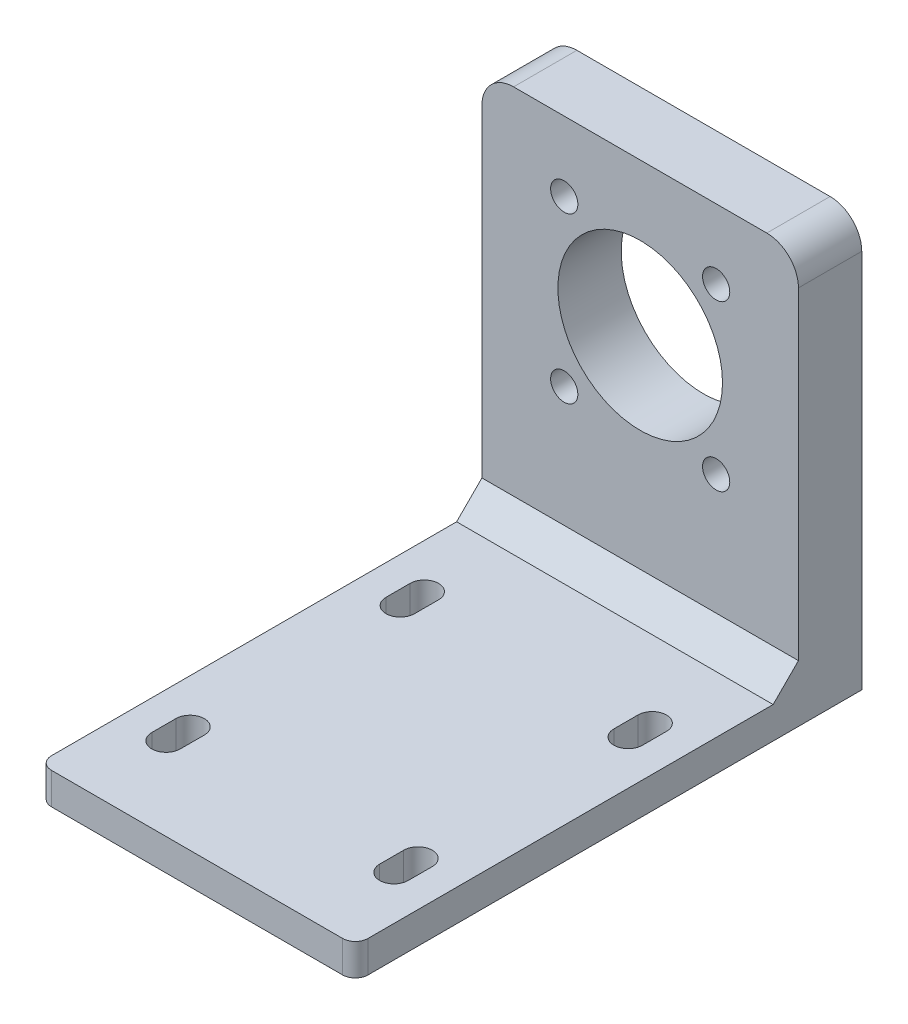
ISO-10303-21;
HEADER;
FILE_DESCRIPTION(('STEP AP214'),'2;1');
FILE_NAME('part.step','',(''),(''),'','','');
FILE_SCHEMA(('AUTOMOTIVE_DESIGN { 1 0 10303 214 1 1 1 1 }'));
ENDSEC;
DATA;
#1=APPLICATION_CONTEXT('core data for automotive mechanical design processes');
#2=APPLICATION_PROTOCOL_DEFINITION('international standard','automotive_design',2000,#1);
#3=PRODUCT_CONTEXT('',#1,'mechanical');
#4=PRODUCT('Part','Part','',(#3));
#5=PRODUCT_RELATED_PRODUCT_CATEGORY('part','',(#4));
#6=PRODUCT_DEFINITION_FORMATION('','',#4);
#7=PRODUCT_DEFINITION_CONTEXT('part definition',#1,'design');
#8=PRODUCT_DEFINITION('design','',#6,#7);
#9=PRODUCT_DEFINITION_SHAPE('','',#8);
#10=(LENGTH_UNIT() NAMED_UNIT(*) SI_UNIT(.MILLI.,.METRE.));
#11=(NAMED_UNIT(*) PLANE_ANGLE_UNIT() SI_UNIT($,.RADIAN.));
#12=(NAMED_UNIT(*) SI_UNIT($,.STERADIAN.) SOLID_ANGLE_UNIT());
#13=UNCERTAINTY_MEASURE_WITH_UNIT(LENGTH_MEASURE(1.E-05),#10,'distance_accuracy_value','');
#14=(GEOMETRIC_REPRESENTATION_CONTEXT(3) GLOBAL_UNCERTAINTY_ASSIGNED_CONTEXT((#13)) GLOBAL_UNIT_ASSIGNED_CONTEXT((#10,
#11,#12)) REPRESENTATION_CONTEXT('',''));
#15=CARTESIAN_POINT('',(0.,0.,0.));
#16=DIRECTION('',(0.,0.,1.));
#17=DIRECTION('',(1.,0.,0.));
#18=AXIS2_PLACEMENT_3D('',#15,#16,#17);
#19=CARTESIAN_POINT('',(25.,-30.,80.));
#20=DIRECTION('',(0.,-1.,0.));
#21=DIRECTION('',(0.,0.,-1.));
#22=AXIS2_PLACEMENT_3D('',#19,#20,#21);
#23=PLANE('',#22);
#24=DIRECTION('',(0.,0.,-1.));
#25=VECTOR('',#24,1.);
#26=CARTESIAN_POINT('',(-15.75,-30.,80.));
#27=LINE('',#26,#25);
#28=CARTESIAN_POINT('',(-15.75,-30.,66.9));
#29=VERTEX_POINT('',#28);
#30=CARTESIAN_POINT('',(-15.75,-30.,63.1));
#31=VERTEX_POINT('',#30);
#32=EDGE_CURVE('E334',#29,#31,#27,.T.);
#33=ORIENTED_EDGE('',*,*,#32,.F.);
#34=CARTESIAN_POINT('',(-18.,-30.,66.9));
#35=DIRECTION('',(0.,-1.,0.));
#36=DIRECTION('',(0.,0.,-1.));
#37=AXIS2_PLACEMENT_3D('',#34,#35,#36);
#38=CIRCLE('',#37,2.25);
#39=CARTESIAN_POINT('',(-20.25,-30.,66.9));
#40=VERTEX_POINT('',#39);
#41=EDGE_CURVE('E327',#40,#29,#38,.F.);
#42=ORIENTED_EDGE('',*,*,#41,.F.);
#43=DIRECTION('',(0.,0.,-1.));
#44=VECTOR('',#43,1.);
#45=CARTESIAN_POINT('',(-20.25,-30.,80.));
#46=LINE('',#45,#44);
#47=CARTESIAN_POINT('',(-20.25,-30.,63.1));
#48=VERTEX_POINT('',#47);
#49=EDGE_CURVE('E329',#40,#48,#46,.T.);
#50=ORIENTED_EDGE('',*,*,#49,.T.);
#51=CARTESIAN_POINT('',(-18.,-30.,63.1));
#52=DIRECTION('',(0.,-1.,0.));
#53=DIRECTION('',(0.,0.,-1.));
#54=AXIS2_PLACEMENT_3D('',#51,#52,#53);
#55=CIRCLE('',#54,2.25);
#56=EDGE_CURVE('E332',#31,#48,#55,.F.);
#57=ORIENTED_EDGE('',*,*,#56,.F.);
#58=EDGE_LOOP('',(#33,#42,#50,#57));
#59=FACE_BOUND('',#58,.T.);
#60=DIRECTION('',(0.,0.,1.));
#61=VECTOR('',#60,1.);
#62=CARTESIAN_POINT('',(-20.25,-30.,80.));
#63=LINE('',#62,#61);
#64=CARTESIAN_POINT('',(-20.25,-30.,26.1));
#65=VERTEX_POINT('',#64);
#66=CARTESIAN_POINT('',(-20.25,-30.,29.9));
#67=VERTEX_POINT('',#66);
#68=EDGE_CURVE('E303',#65,#67,#63,.T.);
#69=ORIENTED_EDGE('',*,*,#68,.F.);
#70=CARTESIAN_POINT('',(-18.,-30.,26.1));
#71=DIRECTION('',(0.,-1.,0.));
#72=DIRECTION('',(0.,0.,-1.));
#73=AXIS2_PLACEMENT_3D('',#70,#71,#72);
#74=CIRCLE('',#73,2.25);
#75=CARTESIAN_POINT('',(-15.75,-30.,26.1));
#76=VERTEX_POINT('',#75);
#77=EDGE_CURVE('E275',#76,#65,#74,.F.);
#78=ORIENTED_EDGE('',*,*,#77,.F.);
#79=DIRECTION('',(0.,0.,1.));
#80=VECTOR('',#79,1.);
#81=CARTESIAN_POINT('',(-15.75,-30.,80.));
#82=LINE('',#81,#80);
#83=CARTESIAN_POINT('',(-15.75,-30.,29.9));
#84=VERTEX_POINT('',#83);
#85=EDGE_CURVE('E298',#76,#84,#82,.T.);
#86=ORIENTED_EDGE('',*,*,#85,.T.);
#87=CARTESIAN_POINT('',(-18.,-30.,29.9));
#88=DIRECTION('',(0.,-1.,0.));
#89=DIRECTION('',(0.,0.,-1.));
#90=AXIS2_PLACEMENT_3D('',#87,#88,#89);
#91=CIRCLE('',#90,2.25);
#92=EDGE_CURVE('E301',#67,#84,#91,.F.);
#93=ORIENTED_EDGE('',*,*,#92,.F.);
#94=EDGE_LOOP('',(#69,#78,#86,#93));
#95=FACE_BOUND('',#94,.T.);
#96=DIRECTION('',(0.,0.,1.));
#97=VECTOR('',#96,1.);
#98=CARTESIAN_POINT('',(20.25,-30.,80.));
#99=LINE('',#98,#97);
#100=CARTESIAN_POINT('',(20.25,-30.,26.1));
#101=VERTEX_POINT('',#100);
#102=CARTESIAN_POINT('',(20.25,-30.,29.9));
#103=VERTEX_POINT('',#102);
#104=EDGE_CURVE('E310',#101,#103,#99,.T.);
#105=ORIENTED_EDGE('',*,*,#104,.T.);
#106=CARTESIAN_POINT('',(18.,-30.,29.9));
#107=DIRECTION('',(0.,-1.,0.));
#108=DIRECTION('',(0.,0.,-1.));
#109=AXIS2_PLACEMENT_3D('',#106,#107,#108);
#110=CIRCLE('',#109,2.25);
#111=CARTESIAN_POINT('',(15.75,-30.,29.9));
#112=VERTEX_POINT('',#111);
#113=EDGE_CURVE('E313',#103,#112,#110,.T.);
#114=ORIENTED_EDGE('',*,*,#113,.T.);
#115=DIRECTION('',(0.,0.,1.));
#116=VECTOR('',#115,1.);
#117=CARTESIAN_POINT('',(15.7500000000001,-30.,80.));
#118=LINE('',#117,#116);
#119=CARTESIAN_POINT('',(15.75,-30.,26.1));
#120=VERTEX_POINT('',#119);
#121=EDGE_CURVE('E305',#120,#112,#118,.T.);
#122=ORIENTED_EDGE('',*,*,#121,.F.);
#123=CARTESIAN_POINT('',(18.,-30.,26.1));
#124=DIRECTION('',(0.,-1.,0.));
#125=DIRECTION('',(0.,0.,-1.));
#126=AXIS2_PLACEMENT_3D('',#123,#124,#125);
#127=CIRCLE('',#126,2.25);
#128=EDGE_CURVE('E307',#120,#101,#127,.T.);
#129=ORIENTED_EDGE('',*,*,#128,.T.);
#130=EDGE_LOOP('',(#105,#114,#122,#129));
#131=FACE_BOUND('',#130,.T.);
#132=DIRECTION('',(0.,0.,-1.));
#133=VECTOR('',#132,1.);
#134=CARTESIAN_POINT('',(20.25,-30.,80.));
#135=LINE('',#134,#133);
#136=CARTESIAN_POINT('',(20.25,-30.,66.9));
#137=VERTEX_POINT('',#136);
#138=CARTESIAN_POINT('',(20.25,-30.,63.1));
#139=VERTEX_POINT('',#138);
#140=EDGE_CURVE('E322',#137,#139,#135,.T.);
#141=ORIENTED_EDGE('',*,*,#140,.F.);
#142=CARTESIAN_POINT('',(18.,-30.,66.9));
#143=DIRECTION('',(0.,-1.,0.));
#144=DIRECTION('',(0.,0.,-1.));
#145=AXIS2_PLACEMENT_3D('',#142,#143,#144);
#146=CIRCLE('',#145,2.25);
#147=CARTESIAN_POINT('',(15.75,-30.,66.9));
#148=VERTEX_POINT('',#147);
#149=EDGE_CURVE('E324',#137,#148,#146,.T.);
#150=ORIENTED_EDGE('',*,*,#149,.T.);
#151=DIRECTION('',(0.,0.,-1.));
#152=VECTOR('',#151,1.);
#153=CARTESIAN_POINT('',(15.75,-30.,80.));
#154=LINE('',#153,#152);
#155=CARTESIAN_POINT('',(15.75,-30.,63.1));
#156=VERTEX_POINT('',#155);
#157=EDGE_CURVE('E316',#148,#156,#154,.T.);
#158=ORIENTED_EDGE('',*,*,#157,.T.);
#159=CARTESIAN_POINT('',(18.,-30.,63.1));
#160=DIRECTION('',(0.,-1.,0.));
#161=DIRECTION('',(0.,0.,-1.));
#162=AXIS2_PLACEMENT_3D('',#159,#160,#161);
#163=CIRCLE('',#162,2.25);
#164=EDGE_CURVE('E319',#156,#139,#163,.T.);
#165=ORIENTED_EDGE('',*,*,#164,.T.);
#166=EDGE_LOOP('',(#141,#150,#158,#165));
#167=FACE_BOUND('',#166,.T.);
#168=DIRECTION('',(1.,0.,0.));
#169=VECTOR('',#168,1.);
#170=CARTESIAN_POINT('',(25.,-30.,14.));
#171=LINE('',#170,#169);
#172=CARTESIAN_POINT('',(-25.,-30.,14.));
#173=VERTEX_POINT('',#172);
#174=CARTESIAN_POINT('',(25.,-30.,14.));
#175=VERTEX_POINT('',#174);
#176=EDGE_CURVE('E217',#173,#175,#171,.T.);
#177=ORIENTED_EDGE('',*,*,#176,.F.);
#178=DIRECTION('',(0.,0.,-1.));
#179=VECTOR('',#178,1.);
#180=CARTESIAN_POINT('',(-25.,-30.,80.));
#181=LINE('',#180,#179);
#182=CARTESIAN_POINT('',(-25.,-30.,78.));
#183=VERTEX_POINT('',#182);
#184=EDGE_CURVE('E227',#183,#173,#181,.T.);
#185=ORIENTED_EDGE('',*,*,#184,.F.);
#186=CARTESIAN_POINT('',(-23.,-30.,78.));
#187=DIRECTION('',(0.,-1.,0.));
#188=DIRECTION('',(0.,0.,-1.));
#189=AXIS2_PLACEMENT_3D('',#186,#187,#188);
#190=CIRCLE('',#189,2.);
#191=CARTESIAN_POINT('',(-23.,-30.,80.));
#192=VERTEX_POINT('',#191);
#193=EDGE_CURVE('E360',#183,#192,#190,.F.);
#194=ORIENTED_EDGE('',*,*,#193,.T.);
#195=DIRECTION('',(-1.,0.,0.));
#196=VECTOR('',#195,1.);
#197=CARTESIAN_POINT('',(25.,-30.,80.));
#198=LINE('',#197,#196);
#199=CARTESIAN_POINT('',(23.,-30.,80.));
#200=VERTEX_POINT('',#199);
#201=EDGE_CURVE('E234',#200,#192,#198,.T.);
#202=ORIENTED_EDGE('',*,*,#201,.F.);
#203=CARTESIAN_POINT('',(23.,-30.,78.));
#204=DIRECTION('',(0.,-1.,0.));
#205=DIRECTION('',(0.,0.,-1.));
#206=AXIS2_PLACEMENT_3D('',#203,#204,#205);
#207=CIRCLE('',#206,2.);
#208=CARTESIAN_POINT('',(25.,-30.,78.));
#209=VERTEX_POINT('',#208);
#210=EDGE_CURVE('E362',#200,#209,#207,.F.);
#211=ORIENTED_EDGE('',*,*,#210,.T.);
#212=DIRECTION('',(0.,0.,-1.));
#213=VECTOR('',#212,1.);
#214=CARTESIAN_POINT('',(25.,-30.,80.));
#215=LINE('',#214,#213);
#216=EDGE_CURVE('E230',#209,#175,#215,.T.);
#217=ORIENTED_EDGE('',*,*,#216,.T.);
#218=EDGE_LOOP('',(#177,#185,#194,#202,#211,#217));
#219=FACE_BOUND('',#218,.T.);
#220=ADVANCED_FACE('F38',(#59,#95,#131,#167,#219),#23,.F.);
#221=CARTESIAN_POINT('',(0.,0.,10.));
#222=DIRECTION('',(0.,0.,1.));
#223=DIRECTION('',(1.,0.,0.));
#224=AXIS2_PLACEMENT_3D('',#221,#222,#223);
#225=PLANE('',#224);
#226=CARTESIAN_POINT('',(0.,6.,10.));
#227=DIRECTION('',(0.,0.,1.));
#228=DIRECTION('',(1.,0.,0.));
#229=AXIS2_PLACEMENT_3D('',#226,#227,#228);
#230=CIRCLE('',#229,13.);
#231=CARTESIAN_POINT('',(13.,6.,10.));
#232=VERTEX_POINT('',#231);
#233=EDGE_CURVE('E260',#232,#232,#230,.T.);
#234=ORIENTED_EDGE('',*,*,#233,.F.);
#235=EDGE_LOOP('',(#234));
#236=FACE_BOUND('',#235,.T.);
#237=CARTESIAN_POINT('',(12.,19.,10.));
#238=DIRECTION('',(0.,0.,1.));
#239=DIRECTION('',(1.,0.,0.));
#240=AXIS2_PLACEMENT_3D('',#237,#238,#239);
#241=CIRCLE('',#240,2.15);
#242=CARTESIAN_POINT('',(14.15,19.,10.));
#243=VERTEX_POINT('',#242);
#244=EDGE_CURVE('E263',#243,#243,#241,.F.);
#245=ORIENTED_EDGE('',*,*,#244,.T.);
#246=EDGE_LOOP('',(#245));
#247=FACE_BOUND('',#246,.T.);
#248=CARTESIAN_POINT('',(-12.,19.,10.));
#249=DIRECTION('',(0.,0.,1.));
#250=DIRECTION('',(1.,0.,0.));
#251=AXIS2_PLACEMENT_3D('',#248,#249,#250);
#252=CIRCLE('',#251,2.15);
#253=CARTESIAN_POINT('',(-9.84999999999999,19.,10.));
#254=VERTEX_POINT('',#253);
#255=EDGE_CURVE('E266',#254,#254,#252,.T.);
#256=ORIENTED_EDGE('',*,*,#255,.F.);
#257=EDGE_LOOP('',(#256));
#258=FACE_BOUND('',#257,.T.);
#259=CARTESIAN_POINT('',(12.,-7.,10.));
#260=DIRECTION('',(0.,0.,1.));
#261=DIRECTION('',(1.,0.,0.));
#262=AXIS2_PLACEMENT_3D('',#259,#260,#261);
#263=CIRCLE('',#262,2.15);
#264=CARTESIAN_POINT('',(14.15,-7.,10.));
#265=VERTEX_POINT('',#264);
#266=EDGE_CURVE('E269',#265,#265,#263,.T.);
#267=ORIENTED_EDGE('',*,*,#266,.F.);
#268=EDGE_LOOP('',(#267));
#269=FACE_BOUND('',#268,.T.);
#270=CARTESIAN_POINT('',(-12.,-7.,10.));
#271=DIRECTION('',(0.,0.,1.));
#272=DIRECTION('',(1.,0.,0.));
#273=AXIS2_PLACEMENT_3D('',#270,#271,#272);
#274=CIRCLE('',#273,2.15);
#275=CARTESIAN_POINT('',(-9.85000000000001,-7.,10.));
#276=VERTEX_POINT('',#275);
#277=EDGE_CURVE('E272',#276,#276,#274,.F.);
#278=ORIENTED_EDGE('',*,*,#277,.T.);
#279=EDGE_LOOP('',(#278));
#280=FACE_BOUND('',#279,.T.);
#281=DIRECTION('',(0.,-1.,0.));
#282=VECTOR('',#281,1.);
#283=CARTESIAN_POINT('',(-25.,0.,10.));
#284=LINE('',#283,#282);
#285=CARTESIAN_POINT('',(-25.,25.,10.));
#286=VERTEX_POINT('',#285);
#287=CARTESIAN_POINT('',(-25.,-26.,10.));
#288=VERTEX_POINT('',#287);
#289=EDGE_CURVE('E251',#286,#288,#284,.T.);
#290=ORIENTED_EDGE('',*,*,#289,.T.);
#291=DIRECTION('',(-1.,0.,0.));
#292=VECTOR('',#291,1.);
#293=CARTESIAN_POINT('',(21.,-26.,10.));
#294=LINE('',#293,#292);
#295=CARTESIAN_POINT('',(25.,-26.,10.));
#296=VERTEX_POINT('',#295);
#297=EDGE_CURVE('E218',#296,#288,#294,.T.);
#298=ORIENTED_EDGE('',*,*,#297,.F.);
#299=DIRECTION('',(0.,-1.,0.));
#300=VECTOR('',#299,1.);
#301=CARTESIAN_POINT('',(25.,0.,10.));
#302=LINE('',#301,#300);
#303=CARTESIAN_POINT('',(25.,25.,10.));
#304=VERTEX_POINT('',#303);
#305=EDGE_CURVE('E253',#304,#296,#302,.T.);
#306=ORIENTED_EDGE('',*,*,#305,.F.);
#307=CARTESIAN_POINT('',(20.,25.,10.));
#308=DIRECTION('',(0.,0.,1.));
#309=DIRECTION('',(1.,0.,0.));
#310=AXIS2_PLACEMENT_3D('',#307,#308,#309);
#311=CIRCLE('',#310,5.);
#312=CARTESIAN_POINT('',(20.,30.,10.));
#313=VERTEX_POINT('',#312);
#314=EDGE_CURVE('E348',#304,#313,#311,.T.);
#315=ORIENTED_EDGE('',*,*,#314,.T.);
#316=DIRECTION('',(1.,0.,0.));
#317=VECTOR('',#316,1.);
#318=CARTESIAN_POINT('',(0.,30.,10.));
#319=LINE('',#318,#317);
#320=CARTESIAN_POINT('',(-20.,30.,10.));
#321=VERTEX_POINT('',#320);
#322=EDGE_CURVE('E257',#321,#313,#319,.T.);
#323=ORIENTED_EDGE('',*,*,#322,.F.);
#324=CARTESIAN_POINT('',(-20.,25.,10.));
#325=DIRECTION('',(0.,0.,1.));
#326=DIRECTION('',(1.,0.,0.));
#327=AXIS2_PLACEMENT_3D('',#324,#325,#326);
#328=CIRCLE('',#327,5.);
#329=EDGE_CURVE('E350',#321,#286,#328,.T.);
#330=ORIENTED_EDGE('',*,*,#329,.T.);
#331=EDGE_LOOP('',(#290,#298,#306,#315,#323,#330));
#332=FACE_BOUND('',#331,.T.);
#333=ADVANCED_FACE('F502',(#236,#247,#258,#269,#280,#332),#225,.T.);
#334=CARTESIAN_POINT('',(0.,-35.,0.));
#335=DIRECTION('',(0.,1.,0.));
#336=DIRECTION('',(0.,0.,1.));
#337=AXIS2_PLACEMENT_3D('',#334,#335,#336);
#338=PLANE('',#337);
#339=DIRECTION('',(0.,0.,1.));
#340=VECTOR('',#339,1.);
#341=CARTESIAN_POINT('',(-15.75,-35.,0.));
#342=LINE('',#341,#340);
#343=CARTESIAN_POINT('',(-15.75,-35.,63.1));
#344=VERTEX_POINT('',#343);
#345=CARTESIAN_POINT('',(-15.75,-35.,66.9));
#346=VERTEX_POINT('',#345);
#347=EDGE_CURVE('E378',#344,#346,#342,.T.);
#348=ORIENTED_EDGE('',*,*,#347,.F.);
#349=CARTESIAN_POINT('',(-18.,-35.,63.1));
#350=DIRECTION('',(0.,1.,0.));
#351=DIRECTION('',(0.,0.,1.));
#352=AXIS2_PLACEMENT_3D('',#349,#350,#351);
#353=CIRCLE('',#352,2.25);
#354=CARTESIAN_POINT('',(-20.25,-35.,63.1));
#355=VERTEX_POINT('',#354);
#356=EDGE_CURVE('E467',#355,#344,#353,.F.);
#357=ORIENTED_EDGE('',*,*,#356,.F.);
#358=DIRECTION('',(0.,0.,1.));
#359=VECTOR('',#358,1.);
#360=CARTESIAN_POINT('',(-20.25,-35.,0.));
#361=LINE('',#360,#359);
#362=CARTESIAN_POINT('',(-20.25,-35.,66.9));
#363=VERTEX_POINT('',#362);
#364=EDGE_CURVE('E464',#355,#363,#361,.T.);
#365=ORIENTED_EDGE('',*,*,#364,.T.);
#366=CARTESIAN_POINT('',(-18.,-35.,66.9));
#367=DIRECTION('',(0.,1.,0.));
#368=DIRECTION('',(0.,0.,1.));
#369=AXIS2_PLACEMENT_3D('',#366,#367,#368);
#370=CIRCLE('',#369,2.25);
#371=EDGE_CURVE('E462',#346,#363,#370,.F.);
#372=ORIENTED_EDGE('',*,*,#371,.F.);
#373=EDGE_LOOP('',(#348,#357,#365,#372));
#374=FACE_BOUND('',#373,.T.);
#375=DIRECTION('',(0.,0.,-1.));
#376=VECTOR('',#375,1.);
#377=CARTESIAN_POINT('',(-20.25,-35.,0.));
#378=LINE('',#377,#376);
#379=CARTESIAN_POINT('',(-20.25,-35.,29.9));
#380=VERTEX_POINT('',#379);
#381=CARTESIAN_POINT('',(-20.25,-35.,26.1));
#382=VERTEX_POINT('',#381);
#383=EDGE_CURVE('E437',#380,#382,#378,.T.);
#384=ORIENTED_EDGE('',*,*,#383,.F.);
#385=CARTESIAN_POINT('',(-18.,-35.,29.9));
#386=DIRECTION('',(0.,1.,0.));
#387=DIRECTION('',(0.,0.,1.));
#388=AXIS2_PLACEMENT_3D('',#385,#386,#387);
#389=CIRCLE('',#388,2.25);
#390=CARTESIAN_POINT('',(-15.75,-35.,29.9));
#391=VERTEX_POINT('',#390);
#392=EDGE_CURVE('E435',#391,#380,#389,.F.);
#393=ORIENTED_EDGE('',*,*,#392,.F.);
#394=DIRECTION('',(0.,0.,-1.));
#395=VECTOR('',#394,1.);
#396=CARTESIAN_POINT('',(-15.75,-35.,0.));
#397=LINE('',#396,#395);
#398=CARTESIAN_POINT('',(-15.75,-35.,26.1));
#399=VERTEX_POINT('',#398);
#400=EDGE_CURVE('E432',#391,#399,#397,.T.);
#401=ORIENTED_EDGE('',*,*,#400,.T.);
#402=CARTESIAN_POINT('',(-18.,-35.,26.1));
#403=DIRECTION('',(0.,1.,0.));
#404=DIRECTION('',(0.,0.,1.));
#405=AXIS2_PLACEMENT_3D('',#402,#403,#404);
#406=CIRCLE('',#405,2.25);
#407=EDGE_CURVE('E430',#382,#399,#406,.F.);
#408=ORIENTED_EDGE('',*,*,#407,.F.);
#409=EDGE_LOOP('',(#384,#393,#401,#408));
#410=FACE_BOUND('',#409,.T.);
#411=DIRECTION('',(0.,0.,1.));
#412=VECTOR('',#411,1.);
#413=CARTESIAN_POINT('',(25.,-35.,10.));
#414=LINE('',#413,#412);
#415=CARTESIAN_POINT('',(25.,-35.,0.));
#416=VERTEX_POINT('',#415);
#417=CARTESIAN_POINT('',(25.,-35.,78.));
#418=VERTEX_POINT('',#417);
#419=EDGE_CURVE('E247',#416,#418,#414,.T.);
#420=ORIENTED_EDGE('',*,*,#419,.T.);
#421=CARTESIAN_POINT('',(23.,-35.,78.));
#422=DIRECTION('',(0.,1.,0.));
#423=DIRECTION('',(0.,0.,1.));
#424=AXIS2_PLACEMENT_3D('',#421,#422,#423);
#425=CIRCLE('',#424,2.);
#426=CARTESIAN_POINT('',(23.,-35.,80.));
#427=VERTEX_POINT('',#426);
#428=EDGE_CURVE('E46',#418,#427,#425,.F.);
#429=ORIENTED_EDGE('',*,*,#428,.T.);
#430=DIRECTION('',(1.,0.,0.));
#431=VECTOR('',#430,1.);
#432=CARTESIAN_POINT('',(-25.,-35.,80.));
#433=LINE('',#432,#431);
#434=CARTESIAN_POINT('',(-23.,-35.,80.));
#435=VERTEX_POINT('',#434);
#436=EDGE_CURVE('E239',#435,#427,#433,.T.);
#437=ORIENTED_EDGE('',*,*,#436,.F.);
#438=CARTESIAN_POINT('',(-23.,-35.,78.));
#439=DIRECTION('',(0.,1.,0.));
#440=DIRECTION('',(0.,0.,1.));
#441=AXIS2_PLACEMENT_3D('',#438,#439,#440);
#442=CIRCLE('',#441,2.);
#443=CARTESIAN_POINT('',(-25.,-35.,78.));
#444=VERTEX_POINT('',#443);
#445=EDGE_CURVE('E61',#435,#444,#442,.F.);
#446=ORIENTED_EDGE('',*,*,#445,.T.);
#447=DIRECTION('',(0.,0.,-1.));
#448=VECTOR('',#447,1.);
#449=CARTESIAN_POINT('',(-25.,-35.,0.));
#450=LINE('',#449,#448);
#451=CARTESIAN_POINT('',(-25.,-35.,0.));
#452=VERTEX_POINT('',#451);
#453=EDGE_CURVE('E236',#444,#452,#450,.T.);
#454=ORIENTED_EDGE('',*,*,#453,.T.);
#455=DIRECTION('',(1.,0.,0.));
#456=VECTOR('',#455,1.);
#457=CARTESIAN_POINT('',(25.,-35.,0.));
#458=LINE('',#457,#456);
#459=EDGE_CURVE('E244',#452,#416,#458,.T.);
#460=ORIENTED_EDGE('',*,*,#459,.T.);
#461=EDGE_LOOP('',(#420,#429,#437,#446,#454,#460));
#462=FACE_BOUND('',#461,.T.);
#463=DIRECTION('',(0.,0.,-1.));
#464=VECTOR('',#463,1.);
#465=CARTESIAN_POINT('',(15.75,-35.,0.));
#466=LINE('',#465,#464);
#467=CARTESIAN_POINT('',(15.75,-35.,29.9));
#468=VERTEX_POINT('',#467);
#469=CARTESIAN_POINT('',(15.75,-35.,26.1));
#470=VERTEX_POINT('',#469);
#471=EDGE_CURVE('E440',#468,#470,#466,.T.);
#472=ORIENTED_EDGE('',*,*,#471,.F.);
#473=CARTESIAN_POINT('',(18.,-35.,29.9));
#474=DIRECTION('',(0.,1.,0.));
#475=DIRECTION('',(0.,0.,1.));
#476=AXIS2_PLACEMENT_3D('',#473,#474,#475);
#477=CIRCLE('',#476,2.25);
#478=CARTESIAN_POINT('',(20.25,-35.,29.9));
#479=VERTEX_POINT('',#478);
#480=EDGE_CURVE('E448',#468,#479,#477,.T.);
#481=ORIENTED_EDGE('',*,*,#480,.T.);
#482=DIRECTION('',(0.,0.,-1.));
#483=VECTOR('',#482,1.);
#484=CARTESIAN_POINT('',(20.25,-35.,0.));
#485=LINE('',#484,#483);
#486=CARTESIAN_POINT('',(20.25,-35.,26.1));
#487=VERTEX_POINT('',#486);
#488=EDGE_CURVE('E445',#479,#487,#485,.T.);
#489=ORIENTED_EDGE('',*,*,#488,.T.);
#490=CARTESIAN_POINT('',(18.,-35.,26.1));
#491=DIRECTION('',(0.,1.,0.));
#492=DIRECTION('',(0.,0.,1.));
#493=AXIS2_PLACEMENT_3D('',#490,#491,#492);
#494=CIRCLE('',#493,2.25);
#495=EDGE_CURVE('E442',#487,#470,#494,.T.);
#496=ORIENTED_EDGE('',*,*,#495,.T.);
#497=EDGE_LOOP('',(#472,#481,#489,#496));
#498=FACE_BOUND('',#497,.T.);
#499=DIRECTION('',(0.,0.,1.));
#500=VECTOR('',#499,1.);
#501=CARTESIAN_POINT('',(15.75,-35.,0.));
#502=LINE('',#501,#500);
#503=CARTESIAN_POINT('',(15.75,-35.,63.1));
#504=VERTEX_POINT('',#503);
#505=CARTESIAN_POINT('',(15.75,-35.,66.9));
#506=VERTEX_POINT('',#505);
#507=EDGE_CURVE('E451',#504,#506,#502,.T.);
#508=ORIENTED_EDGE('',*,*,#507,.T.);
#509=CARTESIAN_POINT('',(18.,-35.,66.9));
#510=DIRECTION('',(0.,1.,0.));
#511=DIRECTION('',(0.,0.,1.));
#512=AXIS2_PLACEMENT_3D('',#509,#510,#511);
#513=CIRCLE('',#512,2.25);
#514=CARTESIAN_POINT('',(20.25,-35.,66.9));
#515=VERTEX_POINT('',#514);
#516=EDGE_CURVE('E459',#506,#515,#513,.T.);
#517=ORIENTED_EDGE('',*,*,#516,.T.);
#518=DIRECTION('',(0.,0.,1.));
#519=VECTOR('',#518,1.);
#520=CARTESIAN_POINT('',(20.25,-35.,0.));
#521=LINE('',#520,#519);
#522=CARTESIAN_POINT('',(20.25,-35.,63.1));
#523=VERTEX_POINT('',#522);
#524=EDGE_CURVE('E457',#523,#515,#521,.T.);
#525=ORIENTED_EDGE('',*,*,#524,.F.);
#526=CARTESIAN_POINT('',(18.,-35.,63.1));
#527=DIRECTION('',(0.,1.,0.));
#528=DIRECTION('',(0.,0.,1.));
#529=AXIS2_PLACEMENT_3D('',#526,#527,#528);
#530=CIRCLE('',#529,2.25);
#531=EDGE_CURVE('E454',#523,#504,#530,.T.);
#532=ORIENTED_EDGE('',*,*,#531,.T.);
#533=EDGE_LOOP('',(#508,#517,#525,#532));
#534=FACE_BOUND('',#533,.T.);
#535=ADVANCED_FACE('F368',(#374,#410,#462,#498,#534),#338,.F.);
#536=CARTESIAN_POINT('',(-25.,0.,10.));
#537=DIRECTION('',(1.,0.,0.));
#538=DIRECTION('',(0.,1.,0.));
#539=AXIS2_PLACEMENT_3D('',#536,#537,#538);
#540=PLANE('',#539);
#541=ORIENTED_EDGE('',*,*,#184,.T.);
#542=DIRECTION('',(0.,0.707106781186548,-0.707106781186548));
#543=VECTOR('',#542,1.);
#544=CARTESIAN_POINT('',(-25.,-26.,10.));
#545=LINE('',#544,#543);
#546=EDGE_CURVE('E214',#173,#288,#545,.T.);
#547=ORIENTED_EDGE('',*,*,#546,.T.);
#548=ORIENTED_EDGE('',*,*,#289,.F.);
#549=DIRECTION('',(0.,0.,-1.));
#550=VECTOR('',#549,1.);
#551=CARTESIAN_POINT('',(-25.,25.,0.));
#552=LINE('',#551,#550);
#553=CARTESIAN_POINT('',(-25.,25.,0.));
#554=VERTEX_POINT('',#553);
#555=EDGE_CURVE('E336',#286,#554,#552,.T.);
#556=ORIENTED_EDGE('',*,*,#555,.T.);
#557=DIRECTION('',(0.,-1.,0.));
#558=VECTOR('',#557,1.);
#559=CARTESIAN_POINT('',(-25.,0.,0.));
#560=LINE('',#559,#558);
#561=EDGE_CURVE('E250',#554,#452,#560,.T.);
#562=ORIENTED_EDGE('',*,*,#561,.T.);
#563=ORIENTED_EDGE('',*,*,#453,.F.);
#564=DIRECTION('',(0.,-1.,0.));
#565=VECTOR('',#564,1.);
#566=CARTESIAN_POINT('',(-25.,-30.,78.));
#567=LINE('',#566,#565);
#568=EDGE_CURVE('E12',#444,#183,#567,.F.);
#569=ORIENTED_EDGE('',*,*,#568,.T.);
#570=EDGE_LOOP('',(#541,#547,#548,#556,#562,#563,#569));
#571=FACE_BOUND('',#570,.T.);
#572=ADVANCED_FACE('F232',(#571),#540,.F.);
#573=CARTESIAN_POINT('',(25.,0.,10.));
#574=DIRECTION('',(1.,0.,0.));
#575=DIRECTION('',(0.,1.,0.));
#576=AXIS2_PLACEMENT_3D('',#573,#574,#575);
#577=PLANE('',#576);
#578=DIRECTION('',(0.,0.707106781186548,-0.707106781186548));
#579=VECTOR('',#578,1.);
#580=CARTESIAN_POINT('',(25.,-26.,10.));
#581=LINE('',#580,#579);
#582=EDGE_CURVE('E53',#175,#296,#581,.T.);
#583=ORIENTED_EDGE('',*,*,#582,.F.);
#584=ORIENTED_EDGE('',*,*,#216,.F.);
#585=DIRECTION('',(0.,1.,0.));
#586=VECTOR('',#585,1.);
#587=CARTESIAN_POINT('',(25.,0.,78.));
#588=LINE('',#587,#586);
#589=EDGE_CURVE('E364',#209,#418,#588,.F.);
#590=ORIENTED_EDGE('',*,*,#589,.T.);
#591=ORIENTED_EDGE('',*,*,#419,.F.);
#592=DIRECTION('',(0.,-1.,0.));
#593=VECTOR('',#592,1.);
#594=CARTESIAN_POINT('',(25.,0.,0.));
#595=LINE('',#594,#593);
#596=CARTESIAN_POINT('',(25.,25.,0.));
#597=VERTEX_POINT('',#596);
#598=EDGE_CURVE('E278',#597,#416,#595,.T.);
#599=ORIENTED_EDGE('',*,*,#598,.F.);
#600=DIRECTION('',(0.,0.,-1.));
#601=VECTOR('',#600,1.);
#602=CARTESIAN_POINT('',(25.,25.,10.));
#603=LINE('',#602,#601);
#604=EDGE_CURVE('E352',#597,#304,#603,.F.);
#605=ORIENTED_EDGE('',*,*,#604,.T.);
#606=ORIENTED_EDGE('',*,*,#305,.T.);
#607=EDGE_LOOP('',(#583,#584,#590,#591,#599,#605,#606));
#608=FACE_BOUND('',#607,.T.);
#609=ADVANCED_FACE('F381',(#608),#577,.T.);
#610=CARTESIAN_POINT('',(12.,-7.,10.));
#611=DIRECTION('',(0.,0.,-1.));
#612=DIRECTION('',(-1.,0.,0.));
#613=AXIS2_PLACEMENT_3D('',#610,#611,#612);
#614=CYLINDRICAL_SURFACE('',#613,2.15);
#615=ORIENTED_EDGE('',*,*,#266,.T.);
#616=EDGE_LOOP('',(#615));
#617=FACE_BOUND('',#616,.T.);
#618=CARTESIAN_POINT('',(12.,-7.,0.));
#619=DIRECTION('',(0.,0.,1.));
#620=DIRECTION('',(1.,0.,0.));
#621=AXIS2_PLACEMENT_3D('',#618,#619,#620);
#622=CIRCLE('',#621,2.15);
#623=CARTESIAN_POINT('',(14.15,-7.,0.));
#624=VERTEX_POINT('',#623);
#625=EDGE_CURVE('E292',#624,#624,#622,.T.);
#626=ORIENTED_EDGE('',*,*,#625,.F.);
#627=EDGE_LOOP('',(#626));
#628=FACE_BOUND('',#627,.T.);
#629=ADVANCED_FACE('F523',(#617,#628),#614,.F.);
#630=CARTESIAN_POINT('',(-12.,19.,10.));
#631=DIRECTION('',(0.,0.,-1.));
#632=DIRECTION('',(-1.,0.,0.));
#633=AXIS2_PLACEMENT_3D('',#630,#631,#632);
#634=CYLINDRICAL_SURFACE('',#633,2.15);
#635=ORIENTED_EDGE('',*,*,#255,.T.);
#636=EDGE_LOOP('',(#635));
#637=FACE_BOUND('',#636,.T.);
#638=CARTESIAN_POINT('',(-12.,19.,0.));
#639=DIRECTION('',(0.,0.,1.));
#640=DIRECTION('',(1.,0.,0.));
#641=AXIS2_PLACEMENT_3D('',#638,#639,#640);
#642=CIRCLE('',#641,2.15);
#643=CARTESIAN_POINT('',(-9.84999999999999,19.,0.));
#644=VERTEX_POINT('',#643);
#645=EDGE_CURVE('E289',#644,#644,#642,.T.);
#646=ORIENTED_EDGE('',*,*,#645,.F.);
#647=EDGE_LOOP('',(#646));
#648=FACE_BOUND('',#647,.T.);
#649=ADVANCED_FACE('F526',(#637,#648),#634,.F.);
#650=CARTESIAN_POINT('',(12.,19.,10.));
#651=DIRECTION('',(0.,0.,-1.));
#652=DIRECTION('',(-1.,0.,0.));
#653=AXIS2_PLACEMENT_3D('',#650,#651,#652);
#654=CYLINDRICAL_SURFACE('',#653,2.15);
#655=ORIENTED_EDGE('',*,*,#244,.F.);
#656=EDGE_LOOP('',(#655));
#657=FACE_BOUND('',#656,.T.);
#658=CARTESIAN_POINT('',(12.,19.,0.));
#659=DIRECTION('',(0.,0.,1.));
#660=DIRECTION('',(1.,0.,0.));
#661=AXIS2_PLACEMENT_3D('',#658,#659,#660);
#662=CIRCLE('',#661,2.15);
#663=CARTESIAN_POINT('',(14.15,19.,0.));
#664=VERTEX_POINT('',#663);
#665=EDGE_CURVE('E286',#664,#664,#662,.F.);
#666=ORIENTED_EDGE('',*,*,#665,.T.);
#667=EDGE_LOOP('',(#666));
#668=FACE_BOUND('',#667,.T.);
#669=ADVANCED_FACE('F530',(#657,#668),#654,.F.);
#670=CARTESIAN_POINT('',(0.,6.,10.));
#671=DIRECTION('',(0.,0.,-1.));
#672=DIRECTION('',(-1.,0.,0.));
#673=AXIS2_PLACEMENT_3D('',#670,#671,#672);
#674=CYLINDRICAL_SURFACE('',#673,13.);
#675=ORIENTED_EDGE('',*,*,#233,.T.);
#676=EDGE_LOOP('',(#675));
#677=FACE_BOUND('',#676,.T.);
#678=CARTESIAN_POINT('',(0.,6.,0.));
#679=DIRECTION('',(0.,0.,1.));
#680=DIRECTION('',(1.,0.,0.));
#681=AXIS2_PLACEMENT_3D('',#678,#679,#680);
#682=CIRCLE('',#681,13.);
#683=CARTESIAN_POINT('',(13.,6.,0.));
#684=VERTEX_POINT('',#683);
#685=EDGE_CURVE('E283',#684,#684,#682,.T.);
#686=ORIENTED_EDGE('',*,*,#685,.F.);
#687=EDGE_LOOP('',(#686));
#688=FACE_BOUND('',#687,.T.);
#689=ADVANCED_FACE('F534',(#677,#688),#674,.F.);
#690=CARTESIAN_POINT('',(0.,30.,10.));
#691=DIRECTION('',(0.,1.,0.));
#692=DIRECTION('',(0.,0.,1.));
#693=AXIS2_PLACEMENT_3D('',#690,#691,#692);
#694=PLANE('',#693);
#695=DIRECTION('',(1.,0.,0.));
#696=VECTOR('',#695,1.);
#697=CARTESIAN_POINT('',(0.,30.,0.));
#698=LINE('',#697,#696);
#699=CARTESIAN_POINT('',(-20.,30.,0.));
#700=VERTEX_POINT('',#699);
#701=CARTESIAN_POINT('',(20.,30.,0.));
#702=VERTEX_POINT('',#701);
#703=EDGE_CURVE('E280',#700,#702,#698,.T.);
#704=ORIENTED_EDGE('',*,*,#703,.F.);
#705=DIRECTION('',(0.,0.,-1.));
#706=VECTOR('',#705,1.);
#707=CARTESIAN_POINT('',(-20.,30.,10.));
#708=LINE('',#707,#706);
#709=EDGE_CURVE('E346',#700,#321,#708,.F.);
#710=ORIENTED_EDGE('',*,*,#709,.T.);
#711=ORIENTED_EDGE('',*,*,#322,.T.);
#712=DIRECTION('',(0.,0.,-1.));
#713=VECTOR('',#712,1.);
#714=CARTESIAN_POINT('',(20.,30.,10.));
#715=LINE('',#714,#713);
#716=EDGE_CURVE('E343',#313,#702,#715,.T.);
#717=ORIENTED_EDGE('',*,*,#716,.T.);
#718=EDGE_LOOP('',(#704,#710,#711,#717));
#719=FACE_BOUND('',#718,.T.);
#720=ADVANCED_FACE('F521',(#719),#694,.T.);
#721=CARTESIAN_POINT('',(-12.,-7.,10.));
#722=DIRECTION('',(0.,0.,-1.));
#723=DIRECTION('',(-1.,0.,0.));
#724=AXIS2_PLACEMENT_3D('',#721,#722,#723);
#725=CYLINDRICAL_SURFACE('',#724,2.15);
#726=ORIENTED_EDGE('',*,*,#277,.F.);
#727=EDGE_LOOP('',(#726));
#728=FACE_BOUND('',#727,.T.);
#729=CARTESIAN_POINT('',(-12.,-7.,0.));
#730=DIRECTION('',(0.,0.,1.));
#731=DIRECTION('',(1.,0.,0.));
#732=AXIS2_PLACEMENT_3D('',#729,#730,#731);
#733=CIRCLE('',#732,2.15);
#734=CARTESIAN_POINT('',(-9.85000000000001,-7.,0.));
#735=VERTEX_POINT('',#734);
#736=EDGE_CURVE('E254',#735,#735,#733,.F.);
#737=ORIENTED_EDGE('',*,*,#736,.T.);
#738=EDGE_LOOP('',(#737));
#739=FACE_BOUND('',#738,.T.);
#740=ADVANCED_FACE('F517',(#728,#739),#725,.F.);
#741=CARTESIAN_POINT('',(0.,0.,0.));
#742=DIRECTION('',(0.,0.,1.));
#743=DIRECTION('',(1.,0.,0.));
#744=AXIS2_PLACEMENT_3D('',#741,#742,#743);
#745=PLANE('',#744);
#746=ORIENTED_EDGE('',*,*,#561,.F.);
#747=CARTESIAN_POINT('',(-20.,25.,0.));
#748=DIRECTION('',(0.,0.,1.));
#749=DIRECTION('',(1.,0.,0.));
#750=AXIS2_PLACEMENT_3D('',#747,#748,#749);
#751=CIRCLE('',#750,5.);
#752=EDGE_CURVE('E341',#554,#700,#751,.F.);
#753=ORIENTED_EDGE('',*,*,#752,.T.);
#754=ORIENTED_EDGE('',*,*,#703,.T.);
#755=CARTESIAN_POINT('',(20.,25.,0.));
#756=DIRECTION('',(0.,0.,1.));
#757=DIRECTION('',(1.,0.,0.));
#758=AXIS2_PLACEMENT_3D('',#755,#756,#757);
#759=CIRCLE('',#758,5.);
#760=EDGE_CURVE('E339',#702,#597,#759,.F.);
#761=ORIENTED_EDGE('',*,*,#760,.T.);
#762=ORIENTED_EDGE('',*,*,#598,.T.);
#763=ORIENTED_EDGE('',*,*,#459,.F.);
#764=EDGE_LOOP('',(#746,#753,#754,#761,#762,#763));
#765=FACE_BOUND('',#764,.T.);
#766=ORIENTED_EDGE('',*,*,#685,.T.);
#767=EDGE_LOOP('',(#766));
#768=FACE_BOUND('',#767,.T.);
#769=ORIENTED_EDGE('',*,*,#665,.F.);
#770=EDGE_LOOP('',(#769));
#771=FACE_BOUND('',#770,.T.);
#772=ORIENTED_EDGE('',*,*,#645,.T.);
#773=EDGE_LOOP('',(#772));
#774=FACE_BOUND('',#773,.T.);
#775=ORIENTED_EDGE('',*,*,#625,.T.);
#776=EDGE_LOOP('',(#775));
#777=FACE_BOUND('',#776,.T.);
#778=ORIENTED_EDGE('',*,*,#736,.F.);
#779=EDGE_LOOP('',(#778));
#780=FACE_BOUND('',#779,.T.);
#781=ADVANCED_FACE('F514',(#765,#768,#771,#774,#777,#780),#745,.F.);
#782=CARTESIAN_POINT('',(0.,0.,80.));
#783=DIRECTION('',(0.,0.,1.));
#784=DIRECTION('',(1.,0.,0.));
#785=AXIS2_PLACEMENT_3D('',#782,#783,#784);
#786=PLANE('',#785);
#787=ORIENTED_EDGE('',*,*,#436,.T.);
#788=DIRECTION('',(0.,1.,0.));
#789=VECTOR('',#788,1.);
#790=CARTESIAN_POINT('',(23.,0.,80.));
#791=LINE('',#790,#789);
#792=EDGE_CURVE('E357',#427,#200,#791,.T.);
#793=ORIENTED_EDGE('',*,*,#792,.T.);
#794=ORIENTED_EDGE('',*,*,#201,.T.);
#795=DIRECTION('',(0.,-1.,0.));
#796=VECTOR('',#795,1.);
#797=CARTESIAN_POINT('',(-23.,-35.,80.));
#798=LINE('',#797,#796);
#799=EDGE_CURVE('E354',#192,#435,#798,.T.);
#800=ORIENTED_EDGE('',*,*,#799,.T.);
#801=EDGE_LOOP('',(#787,#793,#794,#800));
#802=FACE_BOUND('',#801,.T.);
#803=ADVANCED_FACE('F375',(#802),#786,.T.);
#804=CARTESIAN_POINT('',(-20.25,30.,0.));
#805=DIRECTION('',(1.,0.,0.));
#806=DIRECTION('',(0.,0.,-1.));
#807=AXIS2_PLACEMENT_3D('',#804,#805,#806);
#808=PLANE('',#807);
#809=ORIENTED_EDGE('',*,*,#383,.T.);
#810=DIRECTION('',(0.,-1.,0.));
#811=VECTOR('',#810,1.);
#812=CARTESIAN_POINT('',(-20.25,30.,26.1));
#813=LINE('',#812,#811);
#814=EDGE_CURVE('E399',#65,#382,#813,.T.);
#815=ORIENTED_EDGE('',*,*,#814,.F.);
#816=ORIENTED_EDGE('',*,*,#68,.T.);
#817=DIRECTION('',(0.,-1.,0.));
#818=VECTOR('',#817,1.);
#819=CARTESIAN_POINT('',(-20.25,30.,29.9));
#820=LINE('',#819,#818);
#821=EDGE_CURVE('E427',#67,#380,#820,.T.);
#822=ORIENTED_EDGE('',*,*,#821,.T.);
#823=EDGE_LOOP('',(#809,#815,#816,#822));
#824=FACE_BOUND('',#823,.T.);
#825=ADVANCED_FACE('F629',(#824),#808,.T.);
#826=CARTESIAN_POINT('',(-18.,30.,29.9));
#827=DIRECTION('',(0.,-1.,0.));
#828=DIRECTION('',(0.,0.,-1.));
#829=AXIS2_PLACEMENT_3D('',#826,#827,#828);
#830=CYLINDRICAL_SURFACE('',#829,2.25);
#831=ORIENTED_EDGE('',*,*,#392,.T.);
#832=ORIENTED_EDGE('',*,*,#821,.F.);
#833=ORIENTED_EDGE('',*,*,#92,.T.);
#834=DIRECTION('',(0.,-1.,0.));
#835=VECTOR('',#834,1.);
#836=CARTESIAN_POINT('',(-15.75,30.,29.9));
#837=LINE('',#836,#835);
#838=EDGE_CURVE('E424',#84,#391,#837,.T.);
#839=ORIENTED_EDGE('',*,*,#838,.T.);
#840=EDGE_LOOP('',(#831,#832,#833,#839));
#841=FACE_BOUND('',#840,.T.);
#842=ADVANCED_FACE('F748',(#841),#830,.F.);
#843=CARTESIAN_POINT('',(-15.75,30.,0.));
#844=DIRECTION('',(1.,0.,0.));
#845=DIRECTION('',(0.,0.,-1.));
#846=AXIS2_PLACEMENT_3D('',#843,#844,#845);
#847=PLANE('',#846);
#848=ORIENTED_EDGE('',*,*,#838,.F.);
#849=ORIENTED_EDGE('',*,*,#85,.F.);
#850=DIRECTION('',(0.,-1.,0.));
#851=VECTOR('',#850,1.);
#852=CARTESIAN_POINT('',(-15.75,30.,26.1));
#853=LINE('',#852,#851);
#854=EDGE_CURVE('E421',#76,#399,#853,.T.);
#855=ORIENTED_EDGE('',*,*,#854,.T.);
#856=ORIENTED_EDGE('',*,*,#400,.F.);
#857=EDGE_LOOP('',(#848,#849,#855,#856));
#858=FACE_BOUND('',#857,.T.);
#859=ADVANCED_FACE('F757',(#858),#847,.F.);
#860=CARTESIAN_POINT('',(-18.,30.,26.1));
#861=DIRECTION('',(0.,-1.,0.));
#862=DIRECTION('',(0.,0.,-1.));
#863=AXIS2_PLACEMENT_3D('',#860,#861,#862);
#864=CYLINDRICAL_SURFACE('',#863,2.25);
#865=ORIENTED_EDGE('',*,*,#407,.T.);
#866=ORIENTED_EDGE('',*,*,#854,.F.);
#867=ORIENTED_EDGE('',*,*,#77,.T.);
#868=ORIENTED_EDGE('',*,*,#814,.T.);
#869=EDGE_LOOP('',(#865,#866,#867,#868));
#870=FACE_BOUND('',#869,.T.);
#871=ADVANCED_FACE('F581',(#870),#864,.F.);
#872=CARTESIAN_POINT('',(18.,30.,29.9));
#873=DIRECTION('',(0.,-1.,0.));
#874=DIRECTION('',(0.,0.,-1.));
#875=AXIS2_PLACEMENT_3D('',#872,#873,#874);
#876=CYLINDRICAL_SURFACE('',#875,2.25);
#877=DIRECTION('',(0.,-1.,0.));
#878=VECTOR('',#877,1.);
#879=CARTESIAN_POINT('',(15.75,30.,29.9));
#880=LINE('',#879,#878);
#881=EDGE_CURVE('E387',#112,#468,#880,.T.);
#882=ORIENTED_EDGE('',*,*,#881,.F.);
#883=ORIENTED_EDGE('',*,*,#113,.F.);
#884=DIRECTION('',(0.,-1.,0.));
#885=VECTOR('',#884,1.);
#886=CARTESIAN_POINT('',(20.25,30.,29.9));
#887=LINE('',#886,#885);
#888=EDGE_CURVE('E396',#103,#479,#887,.T.);
#889=ORIENTED_EDGE('',*,*,#888,.T.);
#890=ORIENTED_EDGE('',*,*,#480,.F.);
#891=EDGE_LOOP('',(#882,#883,#889,#890));
#892=FACE_BOUND('',#891,.T.);
#893=ADVANCED_FACE('F577',(#892),#876,.F.);
#894=CARTESIAN_POINT('',(20.25,30.,0.));
#895=DIRECTION('',(1.,0.,0.));
#896=DIRECTION('',(0.,0.,-1.));
#897=AXIS2_PLACEMENT_3D('',#894,#895,#896);
#898=PLANE('',#897);
#899=ORIENTED_EDGE('',*,*,#888,.F.);
#900=ORIENTED_EDGE('',*,*,#104,.F.);
#901=DIRECTION('',(0.,-1.,0.));
#902=VECTOR('',#901,1.);
#903=CARTESIAN_POINT('',(20.25,30.,26.1));
#904=LINE('',#903,#902);
#905=EDGE_CURVE('E393',#101,#487,#904,.T.);
#906=ORIENTED_EDGE('',*,*,#905,.T.);
#907=ORIENTED_EDGE('',*,*,#488,.F.);
#908=EDGE_LOOP('',(#899,#900,#906,#907));
#909=FACE_BOUND('',#908,.T.);
#910=ADVANCED_FACE('F573',(#909),#898,.F.);
#911=CARTESIAN_POINT('',(18.,30.,26.1));
#912=DIRECTION('',(0.,-1.,0.));
#913=DIRECTION('',(0.,0.,-1.));
#914=AXIS2_PLACEMENT_3D('',#911,#912,#913);
#915=CYLINDRICAL_SURFACE('',#914,2.25);
#916=ORIENTED_EDGE('',*,*,#905,.F.);
#917=ORIENTED_EDGE('',*,*,#128,.F.);
#918=DIRECTION('',(0.,-1.,0.));
#919=VECTOR('',#918,1.);
#920=CARTESIAN_POINT('',(15.75,30.,26.1));
#921=LINE('',#920,#919);
#922=EDGE_CURVE('E389',#120,#470,#921,.T.);
#923=ORIENTED_EDGE('',*,*,#922,.T.);
#924=ORIENTED_EDGE('',*,*,#495,.F.);
#925=EDGE_LOOP('',(#916,#917,#923,#924));
#926=FACE_BOUND('',#925,.T.);
#927=ADVANCED_FACE('F569',(#926),#915,.F.);
#928=CARTESIAN_POINT('',(15.75,30.,0.));
#929=DIRECTION('',(1.,0.,0.));
#930=DIRECTION('',(0.,0.,-1.));
#931=AXIS2_PLACEMENT_3D('',#928,#929,#930);
#932=PLANE('',#931);
#933=ORIENTED_EDGE('',*,*,#471,.T.);
#934=ORIENTED_EDGE('',*,*,#922,.F.);
#935=ORIENTED_EDGE('',*,*,#121,.T.);
#936=ORIENTED_EDGE('',*,*,#881,.T.);
#937=EDGE_LOOP('',(#933,#934,#935,#936));
#938=FACE_BOUND('',#937,.T.);
#939=ADVANCED_FACE('F565',(#938),#932,.T.);
#940=CARTESIAN_POINT('',(18.,30.,66.9));
#941=DIRECTION('',(0.,-1.,0.));
#942=DIRECTION('',(0.,0.,-1.));
#943=AXIS2_PLACEMENT_3D('',#940,#941,#942);
#944=CYLINDRICAL_SURFACE('',#943,2.25);
#945=DIRECTION('',(0.,-1.,0.));
#946=VECTOR('',#945,1.);
#947=CARTESIAN_POINT('',(15.75,30.,66.9));
#948=LINE('',#947,#946);
#949=EDGE_CURVE('E400',#148,#506,#948,.T.);
#950=ORIENTED_EDGE('',*,*,#949,.F.);
#951=ORIENTED_EDGE('',*,*,#149,.F.);
#952=DIRECTION('',(0.,-1.,0.));
#953=VECTOR('',#952,1.);
#954=CARTESIAN_POINT('',(20.25,30.,66.9));
#955=LINE('',#954,#953);
#956=EDGE_CURVE('E390',#137,#515,#955,.T.);
#957=ORIENTED_EDGE('',*,*,#956,.T.);
#958=ORIENTED_EDGE('',*,*,#516,.F.);
#959=EDGE_LOOP('',(#950,#951,#957,#958));
#960=FACE_BOUND('',#959,.T.);
#961=ADVANCED_FACE('F568',(#960),#944,.F.);
#962=CARTESIAN_POINT('',(20.25,30.,0.));
#963=DIRECTION('',(-1.,0.,0.));
#964=DIRECTION('',(0.,0.,1.));
#965=AXIS2_PLACEMENT_3D('',#962,#963,#964);
#966=PLANE('',#965);
#967=ORIENTED_EDGE('',*,*,#524,.T.);
#968=ORIENTED_EDGE('',*,*,#956,.F.);
#969=ORIENTED_EDGE('',*,*,#140,.T.);
#970=DIRECTION('',(0.,-1.,0.));
#971=VECTOR('',#970,1.);
#972=CARTESIAN_POINT('',(20.25,30.,63.1));
#973=LINE('',#972,#971);
#974=EDGE_CURVE('E406',#139,#523,#973,.T.);
#975=ORIENTED_EDGE('',*,*,#974,.T.);
#976=EDGE_LOOP('',(#967,#968,#969,#975));
#977=FACE_BOUND('',#976,.T.);
#978=ADVANCED_FACE('F589',(#977),#966,.T.);
#979=CARTESIAN_POINT('',(18.,30.,63.1));
#980=DIRECTION('',(0.,-1.,0.));
#981=DIRECTION('',(0.,0.,-1.));
#982=AXIS2_PLACEMENT_3D('',#979,#980,#981);
#983=CYLINDRICAL_SURFACE('',#982,2.25);
#984=ORIENTED_EDGE('',*,*,#974,.F.);
#985=ORIENTED_EDGE('',*,*,#164,.F.);
#986=DIRECTION('',(0.,-1.,0.));
#987=VECTOR('',#986,1.);
#988=CARTESIAN_POINT('',(15.75,30.,63.1));
#989=LINE('',#988,#987);
#990=EDGE_CURVE('E402',#156,#504,#989,.T.);
#991=ORIENTED_EDGE('',*,*,#990,.T.);
#992=ORIENTED_EDGE('',*,*,#531,.F.);
#993=EDGE_LOOP('',(#984,#985,#991,#992));
#994=FACE_BOUND('',#993,.T.);
#995=ADVANCED_FACE('F585',(#994),#983,.F.);
#996=CARTESIAN_POINT('',(15.75,30.,0.));
#997=DIRECTION('',(-1.,0.,0.));
#998=DIRECTION('',(0.,0.,1.));
#999=AXIS2_PLACEMENT_3D('',#996,#997,#998);
#1000=PLANE('',#999);
#1001=ORIENTED_EDGE('',*,*,#990,.F.);
#1002=ORIENTED_EDGE('',*,*,#157,.F.);
#1003=ORIENTED_EDGE('',*,*,#949,.T.);
#1004=ORIENTED_EDGE('',*,*,#507,.F.);
#1005=EDGE_LOOP('',(#1001,#1002,#1003,#1004));
#1006=FACE_BOUND('',#1005,.T.);
#1007=ADVANCED_FACE('F499',(#1006),#1000,.F.);
#1008=CARTESIAN_POINT('',(-15.75,30.,0.));
#1009=DIRECTION('',(-1.,0.,0.));
#1010=DIRECTION('',(0.,0.,1.));
#1011=AXIS2_PLACEMENT_3D('',#1008,#1009,#1010);
#1012=PLANE('',#1011);
#1013=ORIENTED_EDGE('',*,*,#347,.T.);
#1014=DIRECTION('',(0.,-1.,0.));
#1015=VECTOR('',#1014,1.);
#1016=CARTESIAN_POINT('',(-15.75,30.,66.9));
#1017=LINE('',#1016,#1015);
#1018=EDGE_CURVE('E385',#29,#346,#1017,.T.);
#1019=ORIENTED_EDGE('',*,*,#1018,.F.);
#1020=ORIENTED_EDGE('',*,*,#32,.T.);
#1021=DIRECTION('',(0.,-1.,0.));
#1022=VECTOR('',#1021,1.);
#1023=CARTESIAN_POINT('',(-15.75,30.,63.1));
#1024=LINE('',#1023,#1022);
#1025=EDGE_CURVE('E403',#31,#344,#1024,.T.);
#1026=ORIENTED_EDGE('',*,*,#1025,.T.);
#1027=EDGE_LOOP('',(#1013,#1019,#1020,#1026));
#1028=FACE_BOUND('',#1027,.T.);
#1029=ADVANCED_FACE('F474',(#1028),#1012,.T.);
#1030=CARTESIAN_POINT('',(-18.,30.,63.1));
#1031=DIRECTION('',(0.,-1.,0.));
#1032=DIRECTION('',(0.,0.,-1.));
#1033=AXIS2_PLACEMENT_3D('',#1030,#1031,#1032);
#1034=CYLINDRICAL_SURFACE('',#1033,2.25);
#1035=ORIENTED_EDGE('',*,*,#356,.T.);
#1036=ORIENTED_EDGE('',*,*,#1025,.F.);
#1037=ORIENTED_EDGE('',*,*,#56,.T.);
#1038=DIRECTION('',(0.,-1.,0.));
#1039=VECTOR('',#1038,1.);
#1040=CARTESIAN_POINT('',(-20.25,30.,63.1));
#1041=LINE('',#1040,#1039);
#1042=EDGE_CURVE('E415',#48,#355,#1041,.T.);
#1043=ORIENTED_EDGE('',*,*,#1042,.T.);
#1044=EDGE_LOOP('',(#1035,#1036,#1037,#1043));
#1045=FACE_BOUND('',#1044,.T.);
#1046=ADVANCED_FACE('F491',(#1045),#1034,.F.);
#1047=CARTESIAN_POINT('',(-20.25,30.,0.));
#1048=DIRECTION('',(-1.,0.,0.));
#1049=DIRECTION('',(0.,0.,1.));
#1050=AXIS2_PLACEMENT_3D('',#1047,#1048,#1049);
#1051=PLANE('',#1050);
#1052=ORIENTED_EDGE('',*,*,#1042,.F.);
#1053=ORIENTED_EDGE('',*,*,#49,.F.);
#1054=DIRECTION('',(0.,-1.,0.));
#1055=VECTOR('',#1054,1.);
#1056=CARTESIAN_POINT('',(-20.25,30.,66.9));
#1057=LINE('',#1056,#1055);
#1058=EDGE_CURVE('E412',#40,#363,#1057,.T.);
#1059=ORIENTED_EDGE('',*,*,#1058,.T.);
#1060=ORIENTED_EDGE('',*,*,#364,.F.);
#1061=EDGE_LOOP('',(#1052,#1053,#1059,#1060));
#1062=FACE_BOUND('',#1061,.T.);
#1063=ADVANCED_FACE('F485',(#1062),#1051,.F.);
#1064=CARTESIAN_POINT('',(-18.,30.,66.9));
#1065=DIRECTION('',(0.,-1.,0.));
#1066=DIRECTION('',(0.,0.,-1.));
#1067=AXIS2_PLACEMENT_3D('',#1064,#1065,#1066);
#1068=CYLINDRICAL_SURFACE('',#1067,2.25);
#1069=ORIENTED_EDGE('',*,*,#371,.T.);
#1070=ORIENTED_EDGE('',*,*,#1058,.F.);
#1071=ORIENTED_EDGE('',*,*,#41,.T.);
#1072=ORIENTED_EDGE('',*,*,#1018,.T.);
#1073=EDGE_LOOP('',(#1069,#1070,#1071,#1072));
#1074=FACE_BOUND('',#1073,.T.);
#1075=ADVANCED_FACE('F481',(#1074),#1068,.F.);
#1076=CARTESIAN_POINT('',(-20.,25.,10.));
#1077=DIRECTION('',(0.,0.,1.));
#1078=DIRECTION('',(1.,0.,0.));
#1079=AXIS2_PLACEMENT_3D('',#1076,#1077,#1078);
#1080=CYLINDRICAL_SURFACE('',#1079,5.);
#1081=ORIENTED_EDGE('',*,*,#329,.F.);
#1082=ORIENTED_EDGE('',*,*,#709,.F.);
#1083=ORIENTED_EDGE('',*,*,#752,.F.);
#1084=ORIENTED_EDGE('',*,*,#555,.F.);
#1085=EDGE_LOOP('',(#1081,#1082,#1083,#1084));
#1086=FACE_BOUND('',#1085,.T.);
#1087=ADVANCED_FACE('F546',(#1086),#1080,.T.);
#1088=CARTESIAN_POINT('',(20.,25.,10.));
#1089=DIRECTION('',(0.,0.,-1.));
#1090=DIRECTION('',(-1.,0.,0.));
#1091=AXIS2_PLACEMENT_3D('',#1088,#1089,#1090);
#1092=CYLINDRICAL_SURFACE('',#1091,5.);
#1093=ORIENTED_EDGE('',*,*,#314,.F.);
#1094=ORIENTED_EDGE('',*,*,#604,.F.);
#1095=ORIENTED_EDGE('',*,*,#760,.F.);
#1096=ORIENTED_EDGE('',*,*,#716,.F.);
#1097=EDGE_LOOP('',(#1093,#1094,#1095,#1096));
#1098=FACE_BOUND('',#1097,.T.);
#1099=ADVANCED_FACE('F549',(#1098),#1092,.T.);
#1100=CARTESIAN_POINT('',(23.,0.,78.));
#1101=DIRECTION('',(0.,1.,0.));
#1102=DIRECTION('',(-1.,0.,0.));
#1103=AXIS2_PLACEMENT_3D('',#1100,#1101,#1102);
#1104=CYLINDRICAL_SURFACE('',#1103,2.);
#1105=ORIENTED_EDGE('',*,*,#428,.F.);
#1106=ORIENTED_EDGE('',*,*,#589,.F.);
#1107=ORIENTED_EDGE('',*,*,#210,.F.);
#1108=ORIENTED_EDGE('',*,*,#792,.F.);
#1109=EDGE_LOOP('',(#1105,#1106,#1107,#1108));
#1110=FACE_BOUND('',#1109,.T.);
#1111=ADVANCED_FACE('F379',(#1110),#1104,.T.);
#1112=CARTESIAN_POINT('',(-23.,0.,78.));
#1113=DIRECTION('',(0.,1.,0.));
#1114=DIRECTION('',(-1.,0.,0.));
#1115=AXIS2_PLACEMENT_3D('',#1112,#1113,#1114);
#1116=CYLINDRICAL_SURFACE('',#1115,2.);
#1117=ORIENTED_EDGE('',*,*,#193,.F.);
#1118=ORIENTED_EDGE('',*,*,#568,.F.);
#1119=ORIENTED_EDGE('',*,*,#445,.F.);
#1120=ORIENTED_EDGE('',*,*,#799,.F.);
#1121=EDGE_LOOP('',(#1117,#1118,#1119,#1120));
#1122=FACE_BOUND('',#1121,.T.);
#1123=ADVANCED_FACE('F40',(#1122),#1116,.T.);
#1124=CARTESIAN_POINT('',(-25.,-26.,10.));
#1125=DIRECTION('',(0.,-0.707106781186548,-0.707106781186548));
#1126=DIRECTION('',(0.,0.707106781186548,-0.707106781186548));
#1127=AXIS2_PLACEMENT_3D('',#1124,#1125,#1126);
#1128=PLANE('',#1127);
#1129=ORIENTED_EDGE('',*,*,#582,.T.);
#1130=ORIENTED_EDGE('',*,*,#297,.T.);
#1131=ORIENTED_EDGE('',*,*,#546,.F.);
#1132=ORIENTED_EDGE('',*,*,#176,.T.);
#1133=EDGE_LOOP('',(#1129,#1130,#1131,#1132));
#1134=FACE_BOUND('',#1133,.T.);
#1135=ADVANCED_FACE('F216',(#1134),#1128,.F.);
#1136=CLOSED_SHELL('',(#220,#333,#535,#572,#609,#629,#649,#669,#689,#720,#740,#781,#803,#825,
#842,#859,#871,#893,#910,#927,#939,#961,#978,#995,#1007,#1029,#1046,#1063,#1075,#1087,#1099,
#1111,#1123,#1135));
#1137=MANIFOLD_SOLID_BREP('B2',#1136);
#1138=ADVANCED_BREP_SHAPE_REPRESENTATION('',(#18,#1137),#14);
#1139=SHAPE_DEFINITION_REPRESENTATION(#9,#1138);
ENDSEC;
END-ISO-10303-21;
